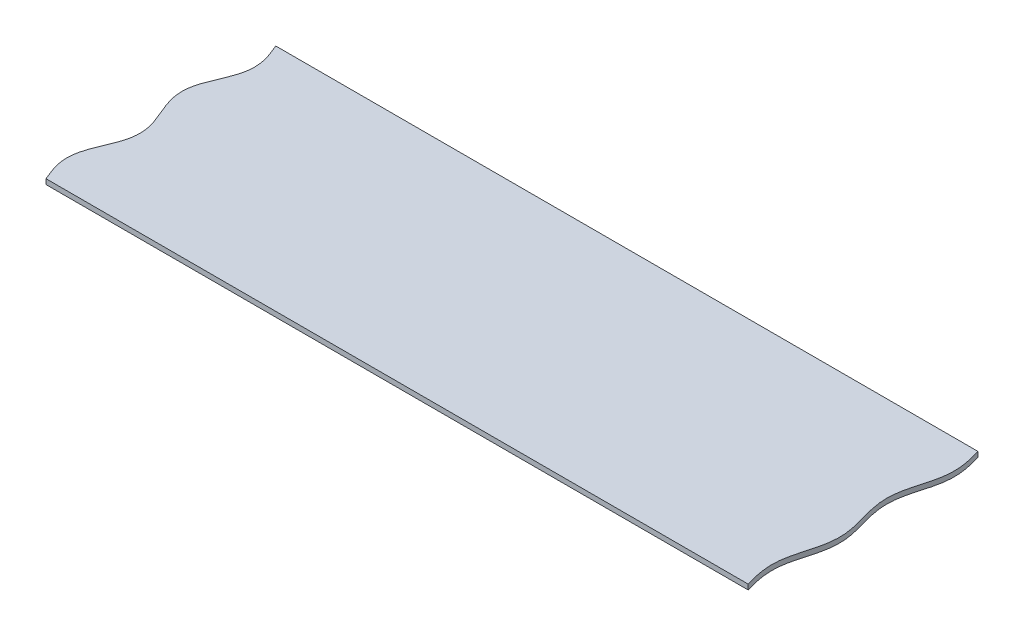
ISO-10303-21;
HEADER;
FILE_DESCRIPTION(('STEP AP214'),'2;1');
FILE_NAME('part.step','',(''),(''),'','','');
FILE_SCHEMA(('AUTOMOTIVE_DESIGN { 1 0 10303 214 1 1 1 1 }'));
ENDSEC;
DATA;
#1=APPLICATION_CONTEXT('core data for automotive mechanical design processes');
#2=APPLICATION_PROTOCOL_DEFINITION('international standard','automotive_design',2000,#1);
#3=PRODUCT_CONTEXT('',#1,'mechanical');
#4=PRODUCT('Part','Part','',(#3));
#5=PRODUCT_RELATED_PRODUCT_CATEGORY('part','',(#4));
#6=PRODUCT_DEFINITION_FORMATION('','',#4);
#7=PRODUCT_DEFINITION_CONTEXT('part definition',#1,'design');
#8=PRODUCT_DEFINITION('design','',#6,#7);
#9=PRODUCT_DEFINITION_SHAPE('','',#8);
#10=(LENGTH_UNIT() NAMED_UNIT(*) SI_UNIT(.MILLI.,.METRE.));
#11=(NAMED_UNIT(*) PLANE_ANGLE_UNIT() SI_UNIT($,.RADIAN.));
#12=(NAMED_UNIT(*) SI_UNIT($,.STERADIAN.) SOLID_ANGLE_UNIT());
#13=UNCERTAINTY_MEASURE_WITH_UNIT(LENGTH_MEASURE(1.E-05),#10,'distance_accuracy_value','');
#14=(GEOMETRIC_REPRESENTATION_CONTEXT(3) GLOBAL_UNCERTAINTY_ASSIGNED_CONTEXT((#13)) GLOBAL_UNIT_ASSIGNED_CONTEXT((#10,
#11,#12)) REPRESENTATION_CONTEXT('',''));
#15=CARTESIAN_POINT('',(0.,0.,0.));
#16=DIRECTION('',(0.,0.,1.));
#17=DIRECTION('',(1.,0.,0.));
#18=AXIS2_PLACEMENT_3D('',#15,#16,#17);
#19=CARTESIAN_POINT('',(-2.35406690885301E-08,0.4,-5.61973492643319E-08));
#20=CARTESIAN_POINT('',(0.0494495661380027,0.4,0.118048236069236));
#21=CARTESIAN_POINT('',(0.111116121183879,0.4,0.265261766996212));
#22=CARTESIAN_POINT('',(0.230875712672927,0.4,0.558055111170189));
#23=CARTESIAN_POINT('',(0.313966247907884,0.4,0.786539770390395));
#24=CARTESIAN_POINT('',(0.362563048289787,0.4,0.927516596163068));
#25=CARTESIAN_POINT('',(0.42457349752239,0.4,1.12026697634904));
#26=CARTESIAN_POINT('',(0.492346833761909,0.4,1.36157607631074));
#27=CARTESIAN_POINT('',(0.554441877209882,0.4,1.64969832437454));
#28=CARTESIAN_POINT('',(0.592274907519892,0.4,1.94940671354694));
#29=CARTESIAN_POINT('',(0.60303131932648,0.4,2.20689908536155));
#30=CARTESIAN_POINT('',(0.596617784063722,0.4,2.46474336959421));
#31=CARTESIAN_POINT('',(0.57306765230296,0.4,2.72166970040439));
#32=CARTESIAN_POINT('',(0.514178040831512,0.4,3.06399896610702));
#33=CARTESIAN_POINT('',(0.399297622639556,0.4,3.48531298984319));
#34=CARTESIAN_POINT('',(0.250895239755389,0.4,3.8956657462423));
#35=CARTESIAN_POINT('',(0.0855364014200948,0.4,4.29915457779182));
#36=CARTESIAN_POINT('',(-0.0995903555498209,0.4,4.7374463966563));
#37=CARTESIAN_POINT('',(-0.296840695920505,0.4,5.22071892240804));
#38=CARTESIAN_POINT('',(-0.493648556000517,0.4,5.79695302279248));
#39=CARTESIAN_POINT('',(-0.618973463332219,0.4,6.48344913641715));
#40=CARTESIAN_POINT('',(-0.599627971634074,0.4,7.23206646503693));
#41=CARTESIAN_POINT('',(-0.381223590951607,0.4,8.12012400416219));
#42=CARTESIAN_POINT('',(-5.56858252543753E-05,0.4,9.00003028030875));
#43=CARTESIAN_POINT('',(0.381336688080153,0.4,9.8798085708948));
#44=CARTESIAN_POINT('',(0.600500416456382,0.4,10.7676510708523));
#45=CARTESIAN_POINT('',(0.620704458219332,0.4,11.5162421500257));
#46=CARTESIAN_POINT('',(0.496048404376883,0.4,12.202876160704));
#47=CARTESIAN_POINT('',(0.299570119251691,0.4,12.7792334867133));
#48=CARTESIAN_POINT('',(0.102439221558558,0.4,13.2625534127883));
#49=CARTESIAN_POINT('',(-0.0826850468523733,0.4,13.7008510557731));
#50=CARTESIAN_POINT('',(-0.248137810947128,0.4,14.1042901034067));
#51=CARTESIAN_POINT('',(-0.396725969096365,0.4,14.5145927201945));
#52=CARTESIAN_POINT('',(-0.511937811817876,0.4,14.9357809783444));
#53=CARTESIAN_POINT('',(-0.57846201816081,0.4,15.3204935820906));
#54=CARTESIAN_POINT('',(-0.604879230090401,0.4,15.6636268757171));
#55=CARTESIAN_POINT('',(-0.596327840453412,0.4,16.0079949296466));
#56=CARTESIAN_POINT('',(-0.554022380580351,0.4,16.3491642860308));
#57=CARTESIAN_POINT('',(-0.483044582191243,0.4,16.6773748268576));
#58=CARTESIAN_POINT('',(-0.392947327461836,0.4,16.9880511698898));
#59=CARTESIAN_POINT('',(-0.286122000299627,0.4,17.2934184343232));
#60=CARTESIAN_POINT('',(-0.184743293074198,0.4,17.5560837715396));
#61=CARTESIAN_POINT('',(-0.0740935836442352,0.4,17.8230984616432));
#62=CARTESIAN_POINT('',(-0.0247247362520249,0.4,17.9409758279025));
#63=CARTESIAN_POINT('',(0.,0.4,17.9999999999999));
#64=B_SPLINE_CURVE_WITH_KNOTS('',4,(#19,#20,#21,#22,#23,#24,#25,#26,#27,#28,#29,#30,#31,#32,#33,
#34,#35,#36,#37,#38,#39,#40,#41,#42,#43,#44,#45,#46,#47,#48,#49,#50,#51,#52,#53,#54,#55,#56,#57,
#58,#59,#60,#61,#62,#63),.UNSPECIFIED.,.F.,.F.,(5,1,1,1,1,1,1,1,1,1,1,1,1,1,1,1,1,1,1,1,1,1,1,1,
1,1,1,1,1,1,1,1,1,1,1,1,1,1,1,1,1,5),(0.0833223804586103,0.110604579934175,0.117425130614809,
0.124245681295442,0.131066231976076,0.13788678265671,0.153149397742294,0.168412012827879,
0.183674668985074,0.191305997063671,0.198937325142268,0.214200036492889,0.229462747843509,
0.25292917999729,0.276395612151072,0.291658349723026,0.30692108729498,0.337446562438887,
0.369116697537713,0.399642007072217,0.430167332794017,0.469468853942264,0.530519820110093,
0.569821340830344,0.600346668093855,0.63087197738376,0.662542111398898,0.69306758670517,
0.708330324358306,0.723593062011442,0.747059493053706,0.770525924095969,0.785788636660392,
0.801051349224814,0.816314004528948,0.831576659833081,0.84683927529585,0.86210189075862,
0.875742992399586,0.889384094040553,0.90302519568152,0.916666297322487),.UNSPECIFIED.);
#65=DIRECTION('',(0.,-1.,0.));
#66=VECTOR('',#65,1.);
#67=SURFACE_OF_LINEAR_EXTRUSION('',#64,#66);
#68=CARTESIAN_POINT('',(-2.35406690885301E-08,0.,-5.61973492643319E-08));
#69=CARTESIAN_POINT('',(0.0494495661380027,0.,0.118048236069236));
#70=CARTESIAN_POINT('',(0.111116121183879,0.,0.265261766996212));
#71=CARTESIAN_POINT('',(0.230875712672927,0.,0.558055111170189));
#72=CARTESIAN_POINT('',(0.313966247907884,0.,0.786539770390395));
#73=CARTESIAN_POINT('',(0.362563048289787,0.,0.927516596163068));
#74=CARTESIAN_POINT('',(0.42457349752239,0.,1.12026697634904));
#75=CARTESIAN_POINT('',(0.492346833761909,0.,1.36157607631074));
#76=CARTESIAN_POINT('',(0.554441877209882,0.,1.64969832437454));
#77=CARTESIAN_POINT('',(0.592274907519892,0.,1.94940671354694));
#78=CARTESIAN_POINT('',(0.60303131932648,0.,2.20689908536155));
#79=CARTESIAN_POINT('',(0.596617784063722,0.,2.46474336959421));
#80=CARTESIAN_POINT('',(0.57306765230296,0.,2.72166970040439));
#81=CARTESIAN_POINT('',(0.514178040831512,0.,3.06399896610702));
#82=CARTESIAN_POINT('',(0.399297622639556,0.,3.48531298984319));
#83=CARTESIAN_POINT('',(0.250895239755389,0.,3.8956657462423));
#84=CARTESIAN_POINT('',(0.0855364014200948,0.,4.29915457779182));
#85=CARTESIAN_POINT('',(-0.0995903555498209,0.,4.7374463966563));
#86=CARTESIAN_POINT('',(-0.296840695920505,0.,5.22071892240804));
#87=CARTESIAN_POINT('',(-0.493648556000517,0.,5.79695302279248));
#88=CARTESIAN_POINT('',(-0.618973463332219,0.,6.48344913641715));
#89=CARTESIAN_POINT('',(-0.599627971634074,0.,7.23206646503693));
#90=CARTESIAN_POINT('',(-0.381223590951607,0.,8.12012400416219));
#91=CARTESIAN_POINT('',(-5.56858252543753E-05,0.,9.00003028030875));
#92=CARTESIAN_POINT('',(0.381336688080153,0.,9.8798085708948));
#93=CARTESIAN_POINT('',(0.600500416456382,0.,10.7676510708523));
#94=CARTESIAN_POINT('',(0.620704458219332,0.,11.5162421500257));
#95=CARTESIAN_POINT('',(0.496048404376883,0.,12.202876160704));
#96=CARTESIAN_POINT('',(0.299570119251691,0.,12.7792334867133));
#97=CARTESIAN_POINT('',(0.102439221558558,0.,13.2625534127883));
#98=CARTESIAN_POINT('',(-0.0826850468523733,0.,13.7008510557731));
#99=CARTESIAN_POINT('',(-0.248137810947128,0.,14.1042901034067));
#100=CARTESIAN_POINT('',(-0.396725969096365,0.,14.5145927201945));
#101=CARTESIAN_POINT('',(-0.511937811817876,0.,14.9357809783444));
#102=CARTESIAN_POINT('',(-0.57846201816081,0.,15.3204935820906));
#103=CARTESIAN_POINT('',(-0.604879230090401,0.,15.6636268757171));
#104=CARTESIAN_POINT('',(-0.596327840453412,0.,16.0079949296466));
#105=CARTESIAN_POINT('',(-0.554022380580351,0.,16.3491642860308));
#106=CARTESIAN_POINT('',(-0.483044582191243,0.,16.6773748268576));
#107=CARTESIAN_POINT('',(-0.392947327461836,0.,16.9880511698898));
#108=CARTESIAN_POINT('',(-0.286122000299627,0.,17.2934184343232));
#109=CARTESIAN_POINT('',(-0.184743293074198,0.,17.5560837715396));
#110=CARTESIAN_POINT('',(-0.0740935836442352,0.,17.8230984616432));
#111=CARTESIAN_POINT('',(-0.0247247362520249,0.,17.9409758279025));
#112=CARTESIAN_POINT('',(0.,0.,17.9999999999999));
#113=B_SPLINE_CURVE_WITH_KNOTS('',4,(#68,#69,#70,#71,#72,#73,#74,#75,#76,#77,#78,#79,#80,#81,
#82,#83,#84,#85,#86,#87,#88,#89,#90,#91,#92,#93,#94,#95,#96,#97,#98,#99,#100,#101,#102,#103,
#104,#105,#106,#107,#108,#109,#110,#111,#112),.UNSPECIFIED.,.F.,.F.,(5,1,1,1,1,1,1,1,1,1,1,1,1,
1,1,1,1,1,1,1,1,1,1,1,1,1,1,1,1,1,1,1,1,1,1,1,1,1,1,1,1,5),(0.0833223804586103,
0.110604579934175,0.117425130614809,0.124245681295442,0.131066231976076,0.13788678265671,
0.153149397742294,0.168412012827879,0.183674668985074,0.191305997063671,0.198937325142268,
0.214200036492889,0.229462747843509,0.25292917999729,0.276395612151072,0.291658349723026,
0.30692108729498,0.337446562438887,0.369116697537713,0.399642007072217,0.430167332794017,
0.469468853942264,0.530519820110093,0.569821340830344,0.600346668093855,0.63087197738376,
0.662542111398898,0.69306758670517,0.708330324358306,0.723593062011442,0.747059493053706,
0.770525924095969,0.785788636660392,0.801051349224814,0.816314004528948,0.831576659833081,
0.84683927529585,0.86210189075862,0.875742992399586,0.889384094040553,0.90302519568152,
0.916666297322487),.UNSPECIFIED.);
#114=CARTESIAN_POINT('',(0.,0.,0.));
#115=VERTEX_POINT('',#114);
#116=CARTESIAN_POINT('',(0.,0.,18.));
#117=VERTEX_POINT('',#116);
#118=EDGE_CURVE('E122',#115,#117,#113,.T.);
#119=ORIENTED_EDGE('',*,*,#118,.T.);
#120=DIRECTION('',(0.,-1.,0.));
#121=VECTOR('',#120,1.);
#122=CARTESIAN_POINT('',(0.,0.4,18.));
#123=LINE('',#122,#121);
#124=CARTESIAN_POINT('',(0.,0.4,18.));
#125=VERTEX_POINT('',#124);
#126=EDGE_CURVE('E11',#125,#117,#123,.T.);
#127=ORIENTED_EDGE('',*,*,#126,.F.);
#128=CARTESIAN_POINT('',(0.,0.4,0.));
#129=VERTEX_POINT('',#128);
#130=EDGE_CURVE('E91',#129,#125,#64,.T.);
#131=ORIENTED_EDGE('',*,*,#130,.F.);
#132=DIRECTION('',(0.,-1.,0.));
#133=VECTOR('',#132,1.);
#134=CARTESIAN_POINT('',(0.,0.4,0.));
#135=LINE('',#134,#133);
#136=EDGE_CURVE('E99',#129,#115,#135,.T.);
#137=ORIENTED_EDGE('',*,*,#136,.T.);
#138=EDGE_LOOP('',(#119,#127,#131,#137));
#139=FACE_BOUND('',#138,.T.);
#140=ADVANCED_FACE('F39',(#139),#67,.F.);
#141=CARTESIAN_POINT('',(55.,0.4,18.));
#142=DIRECTION('',(0.,0.,-1.));
#143=DIRECTION('',(-1.,0.,0.));
#144=AXIS2_PLACEMENT_3D('',#141,#142,#143);
#145=PLANE('',#144);
#146=DIRECTION('',(1.,0.,0.));
#147=VECTOR('',#146,1.);
#148=CARTESIAN_POINT('',(55.,0.,18.));
#149=LINE('',#148,#147);
#150=CARTESIAN_POINT('',(55.,0.,18.));
#151=VERTEX_POINT('',#150);
#152=EDGE_CURVE('E95',#117,#151,#149,.T.);
#153=ORIENTED_EDGE('',*,*,#152,.T.);
#154=DIRECTION('',(0.,-1.,0.));
#155=VECTOR('',#154,1.);
#156=CARTESIAN_POINT('',(55.,0.4,18.));
#157=LINE('',#156,#155);
#158=CARTESIAN_POINT('',(55.,0.4,18.));
#159=VERTEX_POINT('',#158);
#160=EDGE_CURVE('E48',#159,#151,#157,.T.);
#161=ORIENTED_EDGE('',*,*,#160,.F.);
#162=DIRECTION('',(1.,0.,0.));
#163=VECTOR('',#162,1.);
#164=CARTESIAN_POINT('',(55.,0.4,18.));
#165=LINE('',#164,#163);
#166=EDGE_CURVE('E86',#125,#159,#165,.T.);
#167=ORIENTED_EDGE('',*,*,#166,.F.);
#168=ORIENTED_EDGE('',*,*,#126,.T.);
#169=EDGE_LOOP('',(#153,#161,#167,#168));
#170=FACE_BOUND('',#169,.T.);
#171=ADVANCED_FACE('F94',(#170),#145,.F.);
#172=CARTESIAN_POINT('',(55.,0.4,18.));
#173=CARTESIAN_POINT('',(54.9667378256924,0.4,17.880890029629));
#174=CARTESIAN_POINT('',(54.9170257245591,0.4,17.7028040359156));
#175=CARTESIAN_POINT('',(54.810304458252,0.4,17.3090289855781));
#176=CARTESIAN_POINT('',(54.7423116732828,0.4,17.0022477218445));
#177=CARTESIAN_POINT('',(54.6746143981801,0.4,16.6635723699167));
#178=CARTESIAN_POINT('',(54.6316700498228,0.4,16.3509511235449));
#179=CARTESIAN_POINT('',(54.6018816237659,0.4,16.005402716011));
#180=CARTESIAN_POINT('',(54.5971311698113,0.4,15.6687612164325));
#181=CARTESIAN_POINT('',(54.613640074899,0.4,15.3274819051609));
#182=CARTESIAN_POINT('',(54.6570085188122,0.4,14.9486616922822));
#183=CARTESIAN_POINT('',(54.732045155196,0.4,14.5306344703055));
#184=CARTESIAN_POINT('',(54.8505705073407,0.4,14.0361864925675));
#185=CARTESIAN_POINT('',(55.0111999100901,0.4,13.4651151760247));
#186=CARTESIAN_POINT('',(55.1836455218753,0.4,12.8530434725357));
#187=CARTESIAN_POINT('',(55.3327041864408,0.4,12.1901449100634));
#188=CARTESIAN_POINT('',(55.4129363469491,0.4,11.5138994591524));
#189=CARTESIAN_POINT('',(55.4013154749473,0.4,10.7905213385507));
#190=CARTESIAN_POINT('',(55.2617344006233,0.4,9.90745905621063));
#191=CARTESIAN_POINT('',(55.0024504812827,0.4,9.00787392103591));
#192=CARTESIAN_POINT('',(54.7421304186933,0.4,8.10865448639546));
#193=CARTESIAN_POINT('',(54.6003888623518,0.4,7.22312313238518));
#194=CARTESIAN_POINT('',(54.587580107436,0.4,6.49502826090032));
#195=CARTESIAN_POINT('',(54.6675230261254,0.4,5.8163356081294));
#196=CARTESIAN_POINT('',(54.8171414980156,0.4,5.15072772548016));
#197=CARTESIAN_POINT('',(54.9904017341307,0.4,4.53602852402362));
#198=CARTESIAN_POINT('',(55.151200158166,0.4,3.96418526083974));
#199=CARTESIAN_POINT('',(55.2696433221284,0.4,3.46931162760369));
#200=CARTESIAN_POINT('',(55.3444665552088,0.4,3.05124475564531));
#201=CARTESIAN_POINT('',(55.3875977546529,0.4,2.67239706117271));
#202=CARTESIAN_POINT('',(55.4038753932809,0.4,2.33110595375618));
#203=CARTESIAN_POINT('',(55.3988889856708,0.4,1.9944687152498));
#204=CARTESIAN_POINT('',(55.3688777681041,0.4,1.64893884441289));
#205=CARTESIAN_POINT('',(55.3257448156502,0.4,1.33634589733102));
#206=CARTESIAN_POINT('',(55.2578985906343,0.4,0.997698602416941));
#207=CARTESIAN_POINT('',(55.1897723511388,0.4,0.690951549656737));
#208=CARTESIAN_POINT('',(55.0829915406004,0.4,0.297189427372779));
#209=CARTESIAN_POINT('',(55.0332622537181,0.4,0.119109920105096));
#210=CARTESIAN_POINT('',(54.9999999930441,0.4,-2.49088060629552E-08));
#211=B_SPLINE_CURVE_WITH_KNOTS('',4,(#172,#173,#174,#175,#176,#177,#178,#179,#180,#181,#182,
#183,#184,#185,#186,#187,#188,#189,#190,#191,#192,#193,#194,#195,#196,#197,#198,#199,#200,#201,
#202,#203,#204,#205,#206,#207,#208,#209,#210),.UNSPECIFIED.,.F.,.F.,(5,1,1,1,1,1,1,1,1,1,1,1,1,
1,1,1,1,1,1,1,1,1,1,1,1,1,1,1,1,1,1,1,1,1,1,5),(0.0829549338777224,0.109918585966869,
0.123400412011443,0.136882238056016,0.15233091592452,0.167779593793023,0.183228218128331,
0.198676842463638,0.214125488724713,0.229574134985789,0.25267563830746,0.275777141629131,
0.306602972687063,0.337428803744996,0.368326124535989,0.399223428960672,0.430120699894976,
0.468599349620978,0.530394072344551,0.569373352547635,0.600270647037038,0.631167887266557,
0.662422894324816,0.69332023702033,0.724217579715845,0.747319082883185,0.770420586050526,
0.785869232053084,0.801317878055641,0.816766502572619,0.832215127089597,0.847663805365882,
0.863112483642167,0.876594309554724,0.890076135467282,0.917039785883205),.UNSPECIFIED.);
#212=DIRECTION('',(0.,-1.,0.));
#213=VECTOR('',#212,1.);
#214=SURFACE_OF_LINEAR_EXTRUSION('',#211,#213);
#215=CARTESIAN_POINT('',(55.,0.,18.));
#216=CARTESIAN_POINT('',(54.9667378256924,0.,17.880890029629));
#217=CARTESIAN_POINT('',(54.9170257245591,0.,17.7028040359156));
#218=CARTESIAN_POINT('',(54.810304458252,0.,17.3090289855781));
#219=CARTESIAN_POINT('',(54.7423116732828,0.,17.0022477218445));
#220=CARTESIAN_POINT('',(54.6746143981801,0.,16.6635723699167));
#221=CARTESIAN_POINT('',(54.6316700498228,0.,16.3509511235449));
#222=CARTESIAN_POINT('',(54.6018816237659,0.,16.005402716011));
#223=CARTESIAN_POINT('',(54.5971311698113,0.,15.6687612164325));
#224=CARTESIAN_POINT('',(54.613640074899,0.,15.3274819051609));
#225=CARTESIAN_POINT('',(54.6570085188122,0.,14.9486616922822));
#226=CARTESIAN_POINT('',(54.732045155196,0.,14.5306344703055));
#227=CARTESIAN_POINT('',(54.8505705073407,0.,14.0361864925675));
#228=CARTESIAN_POINT('',(55.0111999100901,0.,13.4651151760247));
#229=CARTESIAN_POINT('',(55.1836455218753,0.,12.8530434725357));
#230=CARTESIAN_POINT('',(55.3327041864408,0.,12.1901449100634));
#231=CARTESIAN_POINT('',(55.4129363469491,0.,11.5138994591524));
#232=CARTESIAN_POINT('',(55.4013154749473,0.,10.7905213385507));
#233=CARTESIAN_POINT('',(55.2617344006233,0.,9.90745905621063));
#234=CARTESIAN_POINT('',(55.0024504812827,0.,9.00787392103591));
#235=CARTESIAN_POINT('',(54.7421304186933,0.,8.10865448639546));
#236=CARTESIAN_POINT('',(54.6003888623518,0.,7.22312313238518));
#237=CARTESIAN_POINT('',(54.587580107436,0.,6.49502826090032));
#238=CARTESIAN_POINT('',(54.6675230261254,0.,5.8163356081294));
#239=CARTESIAN_POINT('',(54.8171414980156,0.,5.15072772548016));
#240=CARTESIAN_POINT('',(54.9904017341307,0.,4.53602852402362));
#241=CARTESIAN_POINT('',(55.151200158166,0.,3.96418526083974));
#242=CARTESIAN_POINT('',(55.2696433221284,0.,3.46931162760369));
#243=CARTESIAN_POINT('',(55.3444665552088,0.,3.05124475564531));
#244=CARTESIAN_POINT('',(55.3875977546529,0.,2.67239706117271));
#245=CARTESIAN_POINT('',(55.4038753932809,0.,2.33110595375618));
#246=CARTESIAN_POINT('',(55.3988889856708,0.,1.9944687152498));
#247=CARTESIAN_POINT('',(55.3688777681041,0.,1.64893884441289));
#248=CARTESIAN_POINT('',(55.3257448156502,0.,1.33634589733102));
#249=CARTESIAN_POINT('',(55.2578985906343,0.,0.997698602416941));
#250=CARTESIAN_POINT('',(55.1897723511388,0.,0.690951549656737));
#251=CARTESIAN_POINT('',(55.0829915406004,0.,0.297189427372779));
#252=CARTESIAN_POINT('',(55.0332622537181,0.,0.119109920105096));
#253=CARTESIAN_POINT('',(54.9999999930441,0.,-2.49088060629552E-08));
#254=B_SPLINE_CURVE_WITH_KNOTS('',4,(#215,#216,#217,#218,#219,#220,#221,#222,#223,#224,#225,
#226,#227,#228,#229,#230,#231,#232,#233,#234,#235,#236,#237,#238,#239,#240,#241,#242,#243,#244,
#245,#246,#247,#248,#249,#250,#251,#252,#253),.UNSPECIFIED.,.F.,.F.,(5,1,1,1,1,1,1,1,1,1,1,1,1,
1,1,1,1,1,1,1,1,1,1,1,1,1,1,1,1,1,1,1,1,1,1,5),(0.0829549338777224,0.109918585966869,
0.123400412011443,0.136882238056016,0.15233091592452,0.167779593793023,0.183228218128331,
0.198676842463638,0.214125488724713,0.229574134985789,0.25267563830746,0.275777141629131,
0.306602972687063,0.337428803744996,0.368326124535989,0.399223428960672,0.430120699894976,
0.468599349620978,0.530394072344551,0.569373352547635,0.600270647037038,0.631167887266557,
0.662422894324816,0.69332023702033,0.724217579715845,0.747319082883185,0.770420586050526,
0.785869232053084,0.801317878055641,0.816766502572619,0.832215127089597,0.847663805365882,
0.863112483642167,0.876594309554724,0.890076135467282,0.917039785883205),.UNSPECIFIED.);
#255=CARTESIAN_POINT('',(55.,0.,0.));
#256=VERTEX_POINT('',#255);
#257=EDGE_CURVE('E73',#151,#256,#254,.T.);
#258=ORIENTED_EDGE('',*,*,#257,.T.);
#259=DIRECTION('',(0.,-1.,0.));
#260=VECTOR('',#259,1.);
#261=CARTESIAN_POINT('',(55.,0.4,0.));
#262=LINE('',#261,#260);
#263=CARTESIAN_POINT('',(55.,0.4,0.));
#264=VERTEX_POINT('',#263);
#265=EDGE_CURVE('E96',#264,#256,#262,.T.);
#266=ORIENTED_EDGE('',*,*,#265,.F.);
#267=EDGE_CURVE('E89',#159,#264,#211,.T.);
#268=ORIENTED_EDGE('',*,*,#267,.F.);
#269=ORIENTED_EDGE('',*,*,#160,.T.);
#270=EDGE_LOOP('',(#258,#266,#268,#269));
#271=FACE_BOUND('',#270,.T.);
#272=ADVANCED_FACE('F97',(#271),#214,.F.);
#273=CARTESIAN_POINT('',(0.,0.4,0.));
#274=DIRECTION('',(0.,0.,1.));
#275=DIRECTION('',(1.,0.,0.));
#276=AXIS2_PLACEMENT_3D('',#273,#274,#275);
#277=PLANE('',#276);
#278=DIRECTION('',(-1.,0.,0.));
#279=VECTOR('',#278,1.);
#280=CARTESIAN_POINT('',(0.,0.,0.));
#281=LINE('',#280,#279);
#282=EDGE_CURVE('E79',#256,#115,#281,.T.);
#283=ORIENTED_EDGE('',*,*,#282,.T.);
#284=ORIENTED_EDGE('',*,*,#136,.F.);
#285=DIRECTION('',(-1.,0.,0.));
#286=VECTOR('',#285,1.);
#287=CARTESIAN_POINT('',(0.,0.4,0.));
#288=LINE('',#287,#286);
#289=EDGE_CURVE('E56',#264,#129,#288,.T.);
#290=ORIENTED_EDGE('',*,*,#289,.F.);
#291=ORIENTED_EDGE('',*,*,#265,.T.);
#292=EDGE_LOOP('',(#283,#284,#290,#291));
#293=FACE_BOUND('',#292,.T.);
#294=ADVANCED_FACE('F111',(#293),#277,.F.);
#295=CARTESIAN_POINT('',(1.71800378624362E-07,0.4,8.99999994238057));
#296=DIRECTION('',(0.,1.,0.));
#297=DIRECTION('',(0.,0.,1.));
#298=AXIS2_PLACEMENT_3D('',#295,#296,#297);
#299=PLANE('',#298);
#300=ORIENTED_EDGE('',*,*,#130,.T.);
#301=ORIENTED_EDGE('',*,*,#166,.T.);
#302=ORIENTED_EDGE('',*,*,#267,.T.);
#303=ORIENTED_EDGE('',*,*,#289,.T.);
#304=EDGE_LOOP('',(#300,#301,#302,#303));
#305=FACE_BOUND('',#304,.T.);
#306=ADVANCED_FACE('F87',(#305),#299,.T.);
#307=CARTESIAN_POINT('',(1.71800378624362E-07,0.,8.99999994238057));
#308=DIRECTION('',(0.,1.,0.));
#309=DIRECTION('',(0.,0.,1.));
#310=AXIS2_PLACEMENT_3D('',#307,#308,#309);
#311=PLANE('',#310);
#312=ORIENTED_EDGE('',*,*,#118,.F.);
#313=ORIENTED_EDGE('',*,*,#282,.F.);
#314=ORIENTED_EDGE('',*,*,#257,.F.);
#315=ORIENTED_EDGE('',*,*,#152,.F.);
#316=EDGE_LOOP('',(#312,#313,#314,#315));
#317=FACE_BOUND('',#316,.T.);
#318=ADVANCED_FACE('F139',(#317),#311,.F.);
#319=CLOSED_SHELL('',(#140,#171,#272,#294,#306,#318));
#320=MANIFOLD_SOLID_BREP('B2',#319);
#321=ADVANCED_BREP_SHAPE_REPRESENTATION('',(#18,#320),#14);
#322=SHAPE_DEFINITION_REPRESENTATION(#9,#321);
ENDSEC;
END-ISO-10303-21;
